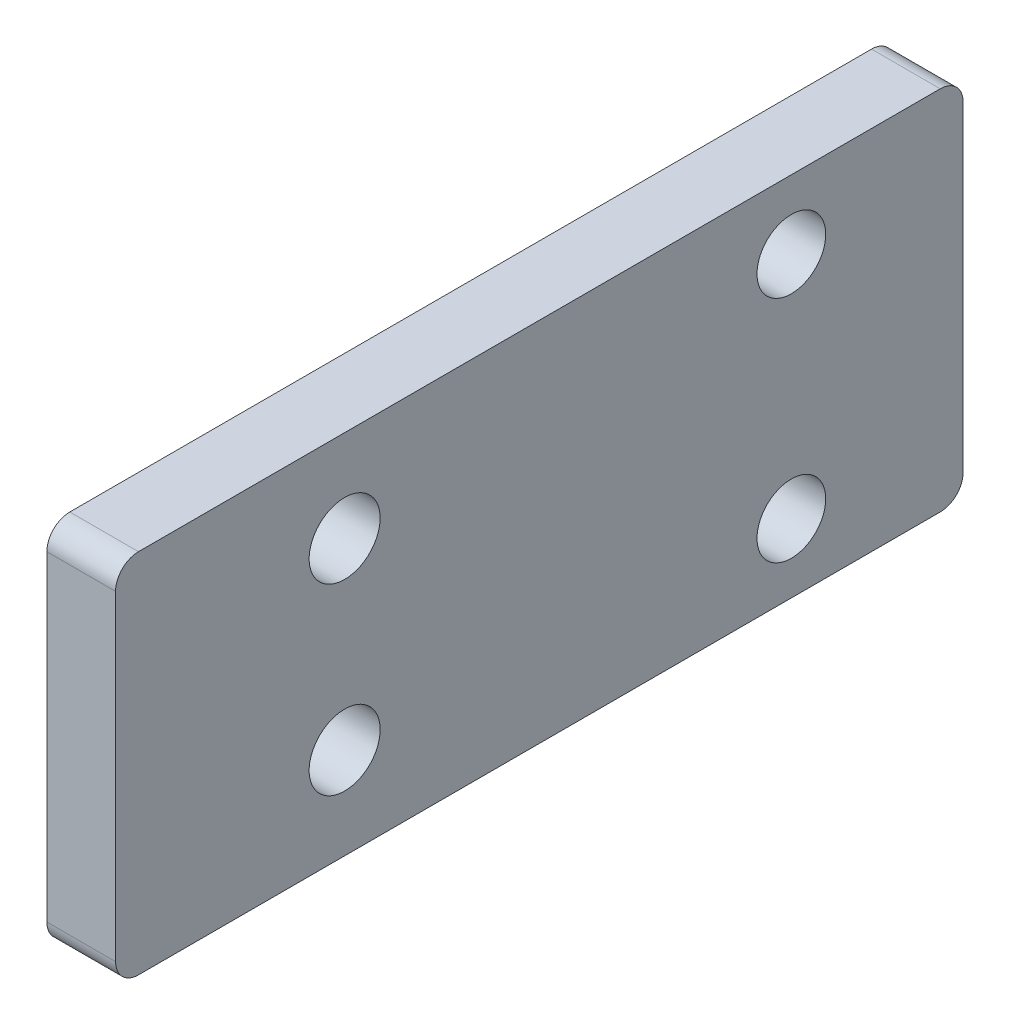
ISO-10303-21;
HEADER;
FILE_DESCRIPTION(('STEP AP214'),'2;1');
FILE_NAME('part.step','',(''),(''),'','','');
FILE_SCHEMA(('AUTOMOTIVE_DESIGN { 1 0 10303 214 1 1 1 1 }'));
ENDSEC;
DATA;
#1=APPLICATION_CONTEXT('core data for automotive mechanical design processes');
#2=APPLICATION_PROTOCOL_DEFINITION('international standard','automotive_design',2000,#1);
#3=PRODUCT_CONTEXT('',#1,'mechanical');
#4=PRODUCT('Part','Part','',(#3));
#5=PRODUCT_RELATED_PRODUCT_CATEGORY('part','',(#4));
#6=PRODUCT_DEFINITION_FORMATION('','',#4);
#7=PRODUCT_DEFINITION_CONTEXT('part definition',#1,'design');
#8=PRODUCT_DEFINITION('design','',#6,#7);
#9=PRODUCT_DEFINITION_SHAPE('','',#8);
#10=(LENGTH_UNIT() NAMED_UNIT(*) SI_UNIT(.MILLI.,.METRE.));
#11=(NAMED_UNIT(*) PLANE_ANGLE_UNIT() SI_UNIT($,.RADIAN.));
#12=(NAMED_UNIT(*) SI_UNIT($,.STERADIAN.) SOLID_ANGLE_UNIT());
#13=UNCERTAINTY_MEASURE_WITH_UNIT(LENGTH_MEASURE(1.E-05),#10,'distance_accuracy_value','');
#14=(GEOMETRIC_REPRESENTATION_CONTEXT(3) GLOBAL_UNCERTAINTY_ASSIGNED_CONTEXT((#13)) GLOBAL_UNIT_ASSIGNED_CONTEXT((#10,
#11,#12)) REPRESENTATION_CONTEXT('',''));
#15=CARTESIAN_POINT('',(0.,0.,0.));
#16=DIRECTION('',(0.,0.,1.));
#17=DIRECTION('',(1.,0.,0.));
#18=AXIS2_PLACEMENT_3D('',#15,#16,#17);
#19=CARTESIAN_POINT('',(3.,0.,18.5));
#20=DIRECTION('',(0.,0.,1.));
#21=DIRECTION('',(1.,0.,0.));
#22=AXIS2_PLACEMENT_3D('',#19,#20,#21);
#23=PLANE('',#22);
#24=DIRECTION('',(0.,1.,0.));
#25=VECTOR('',#24,1.);
#26=CARTESIAN_POINT('',(0.,0.,18.5));
#27=LINE('',#26,#25);
#28=CARTESIAN_POINT('',(0.,-7.,18.5));
#29=VERTEX_POINT('',#28);
#30=CARTESIAN_POINT('',(0.,7.,18.5));
#31=VERTEX_POINT('',#30);
#32=EDGE_CURVE('E161',#29,#31,#27,.T.);
#33=ORIENTED_EDGE('',*,*,#32,.F.);
#34=DIRECTION('',(-1.,0.,0.));
#35=VECTOR('',#34,1.);
#36=CARTESIAN_POINT('',(3.,-7.,18.5));
#37=LINE('',#36,#35);
#38=CARTESIAN_POINT('',(3.,-7.,18.5));
#39=VERTEX_POINT('',#38);
#40=EDGE_CURVE('E11',#29,#39,#37,.F.);
#41=ORIENTED_EDGE('',*,*,#40,.T.);
#42=DIRECTION('',(0.,1.,0.));
#43=VECTOR('',#42,1.);
#44=CARTESIAN_POINT('',(3.,0.,18.5));
#45=LINE('',#44,#43);
#46=CARTESIAN_POINT('',(3.,7.,18.5));
#47=VERTEX_POINT('',#46);
#48=EDGE_CURVE('E163',#39,#47,#45,.T.);
#49=ORIENTED_EDGE('',*,*,#48,.T.);
#50=DIRECTION('',(-1.,0.,0.));
#51=VECTOR('',#50,1.);
#52=CARTESIAN_POINT('',(0.,7.,18.5));
#53=LINE('',#52,#51);
#54=EDGE_CURVE('E44',#47,#31,#53,.T.);
#55=ORIENTED_EDGE('',*,*,#54,.T.);
#56=EDGE_LOOP('',(#33,#41,#49,#55));
#57=FACE_BOUND('',#56,.T.);
#58=ADVANCED_FACE('F36',(#57),#23,.T.);
#59=CARTESIAN_POINT('',(3.,-8.,0.));
#60=DIRECTION('',(0.,-1.,0.));
#61=DIRECTION('',(0.,0.,-1.));
#62=AXIS2_PLACEMENT_3D('',#59,#60,#61);
#63=PLANE('',#62);
#64=DIRECTION('',(0.,0.,1.));
#65=VECTOR('',#64,1.);
#66=CARTESIAN_POINT('',(0.,-8.,0.));
#67=LINE('',#66,#65);
#68=CARTESIAN_POINT('',(0.,-8.,-17.5));
#69=VERTEX_POINT('',#68);
#70=CARTESIAN_POINT('',(0.,-8.,17.5));
#71=VERTEX_POINT('',#70);
#72=EDGE_CURVE('E134',#69,#71,#67,.T.);
#73=ORIENTED_EDGE('',*,*,#72,.F.);
#74=DIRECTION('',(-1.,0.,0.));
#75=VECTOR('',#74,1.);
#76=CARTESIAN_POINT('',(3.,-8.,-17.5));
#77=LINE('',#76,#75);
#78=CARTESIAN_POINT('',(3.,-8.,-17.5));
#79=VERTEX_POINT('',#78);
#80=EDGE_CURVE('E58',#69,#79,#77,.F.);
#81=ORIENTED_EDGE('',*,*,#80,.T.);
#82=DIRECTION('',(0.,0.,1.));
#83=VECTOR('',#82,1.);
#84=CARTESIAN_POINT('',(3.,-8.,0.));
#85=LINE('',#84,#83);
#86=CARTESIAN_POINT('',(3.,-8.,17.5));
#87=VERTEX_POINT('',#86);
#88=EDGE_CURVE('E185',#79,#87,#85,.T.);
#89=ORIENTED_EDGE('',*,*,#88,.T.);
#90=DIRECTION('',(-1.,0.,0.));
#91=VECTOR('',#90,1.);
#92=CARTESIAN_POINT('',(3.,-8.,17.5));
#93=LINE('',#92,#91);
#94=EDGE_CURVE('E153',#87,#71,#93,.T.);
#95=ORIENTED_EDGE('',*,*,#94,.T.);
#96=EDGE_LOOP('',(#73,#81,#89,#95));
#97=FACE_BOUND('',#96,.T.);
#98=ADVANCED_FACE('F215',(#97),#63,.T.);
#99=CARTESIAN_POINT('',(3.,0.,-18.5));
#100=DIRECTION('',(0.,0.,1.));
#101=DIRECTION('',(1.,0.,0.));
#102=AXIS2_PLACEMENT_3D('',#99,#100,#101);
#103=PLANE('',#102);
#104=DIRECTION('',(0.,1.,0.));
#105=VECTOR('',#104,1.);
#106=CARTESIAN_POINT('',(0.,0.,-18.5));
#107=LINE('',#106,#105);
#108=CARTESIAN_POINT('',(0.,-7.,-18.5));
#109=VERTEX_POINT('',#108);
#110=CARTESIAN_POINT('',(0.,7.,-18.5));
#111=VERTEX_POINT('',#110);
#112=EDGE_CURVE('E129',#109,#111,#107,.T.);
#113=ORIENTED_EDGE('',*,*,#112,.T.);
#114=DIRECTION('',(-1.,0.,0.));
#115=VECTOR('',#114,1.);
#116=CARTESIAN_POINT('',(3.,7.,-18.5));
#117=LINE('',#116,#115);
#118=CARTESIAN_POINT('',(3.,7.,-18.5));
#119=VERTEX_POINT('',#118);
#120=EDGE_CURVE('E107',#111,#119,#117,.F.);
#121=ORIENTED_EDGE('',*,*,#120,.T.);
#122=DIRECTION('',(0.,1.,0.));
#123=VECTOR('',#122,1.);
#124=CARTESIAN_POINT('',(3.,0.,-18.5));
#125=LINE('',#124,#123);
#126=CARTESIAN_POINT('',(3.,-7.,-18.5));
#127=VERTEX_POINT('',#126);
#128=EDGE_CURVE('E182',#127,#119,#125,.T.);
#129=ORIENTED_EDGE('',*,*,#128,.F.);
#130=DIRECTION('',(-1.,0.,0.));
#131=VECTOR('',#130,1.);
#132=CARTESIAN_POINT('',(0.,-7.,-18.5));
#133=LINE('',#132,#131);
#134=EDGE_CURVE('E112',#127,#109,#133,.T.);
#135=ORIENTED_EDGE('',*,*,#134,.T.);
#136=EDGE_LOOP('',(#113,#121,#129,#135));
#137=FACE_BOUND('',#136,.T.);
#138=ADVANCED_FACE('F212',(#137),#103,.F.);
#139=CARTESIAN_POINT('',(3.,5.,-11.));
#140=DIRECTION('',(-1.,0.,0.));
#141=DIRECTION('',(0.,0.,1.));
#142=AXIS2_PLACEMENT_3D('',#139,#140,#141);
#143=CYLINDRICAL_SURFACE('',#142,1.5);
#144=CARTESIAN_POINT('',(3.,5.,-11.));
#145=DIRECTION('',(1.,0.,0.));
#146=DIRECTION('',(0.,0.,-1.));
#147=AXIS2_PLACEMENT_3D('',#144,#145,#146);
#148=CIRCLE('',#147,1.5);
#149=CARTESIAN_POINT('',(3.,5.,-12.5));
#150=VERTEX_POINT('',#149);
#151=EDGE_CURVE('E188',#150,#150,#148,.T.);
#152=ORIENTED_EDGE('',*,*,#151,.T.);
#153=EDGE_LOOP('',(#152));
#154=FACE_BOUND('',#153,.T.);
#155=CARTESIAN_POINT('',(0.,5.,-11.));
#156=DIRECTION('',(1.,0.,0.));
#157=DIRECTION('',(0.,0.,-1.));
#158=AXIS2_PLACEMENT_3D('',#155,#156,#157);
#159=CIRCLE('',#158,1.5);
#160=CARTESIAN_POINT('',(0.,5.,-12.5));
#161=VERTEX_POINT('',#160);
#162=EDGE_CURVE('E167',#161,#161,#159,.T.);
#163=ORIENTED_EDGE('',*,*,#162,.F.);
#164=EDGE_LOOP('',(#163));
#165=FACE_BOUND('',#164,.T.);
#166=ADVANCED_FACE('F231',(#154,#165),#143,.F.);
#167=CARTESIAN_POINT('',(3.,-5.,-11.));
#168=DIRECTION('',(-1.,0.,0.));
#169=DIRECTION('',(0.,0.,1.));
#170=AXIS2_PLACEMENT_3D('',#167,#168,#169);
#171=CYLINDRICAL_SURFACE('',#170,1.5);
#172=CARTESIAN_POINT('',(3.,-5.,-11.));
#173=DIRECTION('',(1.,0.,0.));
#174=DIRECTION('',(0.,0.,-1.));
#175=AXIS2_PLACEMENT_3D('',#172,#173,#174);
#176=CIRCLE('',#175,1.5);
#177=CARTESIAN_POINT('',(3.,-5.,-12.5));
#178=VERTEX_POINT('',#177);
#179=EDGE_CURVE('E191',#178,#178,#176,.T.);
#180=ORIENTED_EDGE('',*,*,#179,.T.);
#181=EDGE_LOOP('',(#180));
#182=FACE_BOUND('',#181,.T.);
#183=CARTESIAN_POINT('',(0.,-5.,-11.));
#184=DIRECTION('',(1.,0.,0.));
#185=DIRECTION('',(0.,0.,-1.));
#186=AXIS2_PLACEMENT_3D('',#183,#184,#185);
#187=CIRCLE('',#186,1.5);
#188=CARTESIAN_POINT('',(0.,-5.,-12.5));
#189=VERTEX_POINT('',#188);
#190=EDGE_CURVE('E170',#189,#189,#187,.T.);
#191=ORIENTED_EDGE('',*,*,#190,.F.);
#192=EDGE_LOOP('',(#191));
#193=FACE_BOUND('',#192,.T.);
#194=ADVANCED_FACE('F234',(#182,#193),#171,.F.);
#195=CARTESIAN_POINT('',(3.,4.,8.5));
#196=DIRECTION('',(-1.,0.,0.));
#197=DIRECTION('',(0.,0.,1.));
#198=AXIS2_PLACEMENT_3D('',#195,#196,#197);
#199=CYLINDRICAL_SURFACE('',#198,1.55);
#200=CARTESIAN_POINT('',(3.,4.,8.5));
#201=DIRECTION('',(1.,0.,0.));
#202=DIRECTION('',(0.,0.,-1.));
#203=AXIS2_PLACEMENT_3D('',#200,#201,#202);
#204=CIRCLE('',#203,1.55);
#205=CARTESIAN_POINT('',(3.,4.,6.95));
#206=VERTEX_POINT('',#205);
#207=EDGE_CURVE('E132',#206,#206,#204,.T.);
#208=ORIENTED_EDGE('',*,*,#207,.T.);
#209=EDGE_LOOP('',(#208));
#210=FACE_BOUND('',#209,.T.);
#211=CARTESIAN_POINT('',(0.,4.,8.5));
#212=DIRECTION('',(1.,0.,0.));
#213=DIRECTION('',(0.,0.,-1.));
#214=AXIS2_PLACEMENT_3D('',#211,#212,#213);
#215=CIRCLE('',#214,1.55);
#216=CARTESIAN_POINT('',(0.,4.,6.95));
#217=VERTEX_POINT('',#216);
#218=EDGE_CURVE('E175',#217,#217,#215,.T.);
#219=ORIENTED_EDGE('',*,*,#218,.F.);
#220=EDGE_LOOP('',(#219));
#221=FACE_BOUND('',#220,.T.);
#222=ADVANCED_FACE('F197',(#210,#221),#199,.F.);
#223=CARTESIAN_POINT('',(3.,-4.,8.5));
#224=DIRECTION('',(-1.,0.,0.));
#225=DIRECTION('',(0.,0.,1.));
#226=AXIS2_PLACEMENT_3D('',#223,#224,#225);
#227=CYLINDRICAL_SURFACE('',#226,1.55);
#228=CARTESIAN_POINT('',(3.,-4.,8.5));
#229=DIRECTION('',(1.,0.,0.));
#230=DIRECTION('',(0.,0.,-1.));
#231=AXIS2_PLACEMENT_3D('',#228,#229,#230);
#232=CIRCLE('',#231,1.55);
#233=CARTESIAN_POINT('',(3.,-4.,6.95));
#234=VERTEX_POINT('',#233);
#235=EDGE_CURVE('E128',#234,#234,#232,.T.);
#236=ORIENTED_EDGE('',*,*,#235,.T.);
#237=EDGE_LOOP('',(#236));
#238=FACE_BOUND('',#237,.T.);
#239=CARTESIAN_POINT('',(0.,-4.,8.5));
#240=DIRECTION('',(1.,0.,0.));
#241=DIRECTION('',(0.,0.,-1.));
#242=AXIS2_PLACEMENT_3D('',#239,#240,#241);
#243=CIRCLE('',#242,1.55);
#244=CARTESIAN_POINT('',(0.,-4.,6.95));
#245=VERTEX_POINT('',#244);
#246=EDGE_CURVE('E178',#245,#245,#243,.T.);
#247=ORIENTED_EDGE('',*,*,#246,.F.);
#248=EDGE_LOOP('',(#247));
#249=FACE_BOUND('',#248,.T.);
#250=ADVANCED_FACE('F241',(#238,#249),#227,.F.);
#251=CARTESIAN_POINT('',(3.,8.,0.));
#252=DIRECTION('',(0.,-1.,0.));
#253=DIRECTION('',(0.,0.,-1.));
#254=AXIS2_PLACEMENT_3D('',#251,#252,#253);
#255=PLANE('',#254);
#256=DIRECTION('',(0.,0.,1.));
#257=VECTOR('',#256,1.);
#258=CARTESIAN_POINT('',(3.,8.,0.));
#259=LINE('',#258,#257);
#260=CARTESIAN_POINT('',(3.,8.,-17.5));
#261=VERTEX_POINT('',#260);
#262=CARTESIAN_POINT('',(3.,8.,17.5));
#263=VERTEX_POINT('',#262);
#264=EDGE_CURVE('E122',#261,#263,#259,.T.);
#265=ORIENTED_EDGE('',*,*,#264,.F.);
#266=DIRECTION('',(-1.,0.,0.));
#267=VECTOR('',#266,1.);
#268=CARTESIAN_POINT('',(3.,8.,-17.5));
#269=LINE('',#268,#267);
#270=CARTESIAN_POINT('',(0.,8.,-17.5));
#271=VERTEX_POINT('',#270);
#272=EDGE_CURVE('E106',#261,#271,#269,.T.);
#273=ORIENTED_EDGE('',*,*,#272,.T.);
#274=DIRECTION('',(0.,0.,1.));
#275=VECTOR('',#274,1.);
#276=CARTESIAN_POINT('',(0.,8.,0.));
#277=LINE('',#276,#275);
#278=CARTESIAN_POINT('',(0.,8.,17.5));
#279=VERTEX_POINT('',#278);
#280=EDGE_CURVE('E119',#271,#279,#277,.T.);
#281=ORIENTED_EDGE('',*,*,#280,.T.);
#282=DIRECTION('',(-1.,0.,0.));
#283=VECTOR('',#282,1.);
#284=CARTESIAN_POINT('',(3.,8.,17.5));
#285=LINE('',#284,#283);
#286=EDGE_CURVE('E124',#279,#263,#285,.F.);
#287=ORIENTED_EDGE('',*,*,#286,.T.);
#288=EDGE_LOOP('',(#265,#273,#281,#287));
#289=FACE_BOUND('',#288,.T.);
#290=ADVANCED_FACE('F118',(#289),#255,.F.);
#291=CARTESIAN_POINT('',(3.,0.,0.));
#292=DIRECTION('',(1.,0.,0.));
#293=DIRECTION('',(0.,0.,-1.));
#294=AXIS2_PLACEMENT_3D('',#291,#292,#293);
#295=PLANE('',#294);
#296=ORIENTED_EDGE('',*,*,#235,.F.);
#297=EDGE_LOOP('',(#296));
#298=FACE_BOUND('',#297,.T.);
#299=ORIENTED_EDGE('',*,*,#207,.F.);
#300=EDGE_LOOP('',(#299));
#301=FACE_BOUND('',#300,.T.);
#302=ORIENTED_EDGE('',*,*,#179,.F.);
#303=EDGE_LOOP('',(#302));
#304=FACE_BOUND('',#303,.T.);
#305=ORIENTED_EDGE('',*,*,#151,.F.);
#306=EDGE_LOOP('',(#305));
#307=FACE_BOUND('',#306,.T.);
#308=ORIENTED_EDGE('',*,*,#128,.T.);
#309=CARTESIAN_POINT('',(3.,7.,-17.5));
#310=DIRECTION('',(1.,0.,0.));
#311=DIRECTION('',(0.,0.,-1.));
#312=AXIS2_PLACEMENT_3D('',#309,#310,#311);
#313=CIRCLE('',#312,1.);
#314=EDGE_CURVE('E151',#119,#261,#313,.T.);
#315=ORIENTED_EDGE('',*,*,#314,.T.);
#316=ORIENTED_EDGE('',*,*,#264,.T.);
#317=CARTESIAN_POINT('',(3.,7.,17.5));
#318=DIRECTION('',(1.,0.,0.));
#319=DIRECTION('',(0.,0.,-1.));
#320=AXIS2_PLACEMENT_3D('',#317,#318,#319);
#321=CIRCLE('',#320,1.);
#322=EDGE_CURVE('E146',#263,#47,#321,.T.);
#323=ORIENTED_EDGE('',*,*,#322,.T.);
#324=ORIENTED_EDGE('',*,*,#48,.F.);
#325=CARTESIAN_POINT('',(3.,-7.,17.5));
#326=DIRECTION('',(1.,0.,0.));
#327=DIRECTION('',(0.,0.,-1.));
#328=AXIS2_PLACEMENT_3D('',#325,#326,#327);
#329=CIRCLE('',#328,1.);
#330=EDGE_CURVE('E51',#39,#87,#329,.T.);
#331=ORIENTED_EDGE('',*,*,#330,.T.);
#332=ORIENTED_EDGE('',*,*,#88,.F.);
#333=CARTESIAN_POINT('',(3.,-7.,-17.5));
#334=DIRECTION('',(1.,0.,0.));
#335=DIRECTION('',(0.,0.,-1.));
#336=AXIS2_PLACEMENT_3D('',#333,#334,#335);
#337=CIRCLE('',#336,1.);
#338=EDGE_CURVE('E149',#79,#127,#337,.T.);
#339=ORIENTED_EDGE('',*,*,#338,.T.);
#340=EDGE_LOOP('',(#308,#315,#316,#323,#324,#331,#332,#339));
#341=FACE_BOUND('',#340,.T.);
#342=ADVANCED_FACE('F200',(#298,#301,#304,#307,#341),#295,.T.);
#343=CARTESIAN_POINT('',(0.,0.,0.));
#344=DIRECTION('',(1.,0.,0.));
#345=DIRECTION('',(0.,0.,-1.));
#346=AXIS2_PLACEMENT_3D('',#343,#344,#345);
#347=PLANE('',#346);
#348=ORIENTED_EDGE('',*,*,#246,.T.);
#349=EDGE_LOOP('',(#348));
#350=FACE_BOUND('',#349,.T.);
#351=ORIENTED_EDGE('',*,*,#218,.T.);
#352=EDGE_LOOP('',(#351));
#353=FACE_BOUND('',#352,.T.);
#354=ORIENTED_EDGE('',*,*,#190,.T.);
#355=EDGE_LOOP('',(#354));
#356=FACE_BOUND('',#355,.T.);
#357=ORIENTED_EDGE('',*,*,#162,.T.);
#358=EDGE_LOOP('',(#357));
#359=FACE_BOUND('',#358,.T.);
#360=ORIENTED_EDGE('',*,*,#280,.F.);
#361=CARTESIAN_POINT('',(0.,7.,-17.5));
#362=DIRECTION('',(1.,0.,0.));
#363=DIRECTION('',(0.,0.,-1.));
#364=AXIS2_PLACEMENT_3D('',#361,#362,#363);
#365=CIRCLE('',#364,1.);
#366=EDGE_CURVE('E102',#271,#111,#365,.F.);
#367=ORIENTED_EDGE('',*,*,#366,.T.);
#368=ORIENTED_EDGE('',*,*,#112,.F.);
#369=CARTESIAN_POINT('',(0.,-7.,-17.5));
#370=DIRECTION('',(1.,0.,0.));
#371=DIRECTION('',(0.,0.,-1.));
#372=AXIS2_PLACEMENT_3D('',#369,#370,#371);
#373=CIRCLE('',#372,1.);
#374=EDGE_CURVE('E113',#109,#69,#373,.F.);
#375=ORIENTED_EDGE('',*,*,#374,.T.);
#376=ORIENTED_EDGE('',*,*,#72,.T.);
#377=CARTESIAN_POINT('',(0.,-7.,17.5));
#378=DIRECTION('',(1.,0.,0.));
#379=DIRECTION('',(0.,0.,-1.));
#380=AXIS2_PLACEMENT_3D('',#377,#378,#379);
#381=CIRCLE('',#380,1.);
#382=EDGE_CURVE('E140',#71,#29,#381,.F.);
#383=ORIENTED_EDGE('',*,*,#382,.T.);
#384=ORIENTED_EDGE('',*,*,#32,.T.);
#385=CARTESIAN_POINT('',(0.,7.,17.5));
#386=DIRECTION('',(1.,0.,0.));
#387=DIRECTION('',(0.,0.,-1.));
#388=AXIS2_PLACEMENT_3D('',#385,#386,#387);
#389=CIRCLE('',#388,1.);
#390=EDGE_CURVE('E123',#31,#279,#389,.F.);
#391=ORIENTED_EDGE('',*,*,#390,.T.);
#392=EDGE_LOOP('',(#360,#367,#368,#375,#376,#383,#384,#391));
#393=FACE_BOUND('',#392,.T.);
#394=ADVANCED_FACE('F126',(#350,#353,#356,#359,#393),#347,.F.);
#395=CARTESIAN_POINT('',(3.,7.,-17.5));
#396=DIRECTION('',(-1.,0.,0.));
#397=DIRECTION('',(0.,0.,1.));
#398=AXIS2_PLACEMENT_3D('',#395,#396,#397);
#399=CYLINDRICAL_SURFACE('',#398,1.);
#400=ORIENTED_EDGE('',*,*,#314,.F.);
#401=ORIENTED_EDGE('',*,*,#120,.F.);
#402=ORIENTED_EDGE('',*,*,#366,.F.);
#403=ORIENTED_EDGE('',*,*,#272,.F.);
#404=EDGE_LOOP('',(#400,#401,#402,#403));
#405=FACE_BOUND('',#404,.T.);
#406=ADVANCED_FACE('F105',(#405),#399,.T.);
#407=CARTESIAN_POINT('',(3.,-7.,-17.5));
#408=DIRECTION('',(1.,0.,0.));
#409=DIRECTION('',(0.,0.,-1.));
#410=AXIS2_PLACEMENT_3D('',#407,#408,#409);
#411=CYLINDRICAL_SURFACE('',#410,1.);
#412=ORIENTED_EDGE('',*,*,#338,.F.);
#413=ORIENTED_EDGE('',*,*,#80,.F.);
#414=ORIENTED_EDGE('',*,*,#374,.F.);
#415=ORIENTED_EDGE('',*,*,#134,.F.);
#416=EDGE_LOOP('',(#412,#413,#414,#415));
#417=FACE_BOUND('',#416,.T.);
#418=ADVANCED_FACE('F214',(#417),#411,.T.);
#419=CARTESIAN_POINT('',(3.,-7.,17.5));
#420=DIRECTION('',(-1.,0.,0.));
#421=DIRECTION('',(0.,0.,1.));
#422=AXIS2_PLACEMENT_3D('',#419,#420,#421);
#423=CYLINDRICAL_SURFACE('',#422,1.);
#424=ORIENTED_EDGE('',*,*,#330,.F.);
#425=ORIENTED_EDGE('',*,*,#40,.F.);
#426=ORIENTED_EDGE('',*,*,#382,.F.);
#427=ORIENTED_EDGE('',*,*,#94,.F.);
#428=EDGE_LOOP('',(#424,#425,#426,#427));
#429=FACE_BOUND('',#428,.T.);
#430=ADVANCED_FACE('F218',(#429),#423,.T.);
#431=CARTESIAN_POINT('',(3.,7.,17.5));
#432=DIRECTION('',(1.,0.,0.));
#433=DIRECTION('',(0.,0.,-1.));
#434=AXIS2_PLACEMENT_3D('',#431,#432,#433);
#435=CYLINDRICAL_SURFACE('',#434,1.);
#436=ORIENTED_EDGE('',*,*,#322,.F.);
#437=ORIENTED_EDGE('',*,*,#286,.F.);
#438=ORIENTED_EDGE('',*,*,#390,.F.);
#439=ORIENTED_EDGE('',*,*,#54,.F.);
#440=EDGE_LOOP('',(#436,#437,#438,#439));
#441=FACE_BOUND('',#440,.T.);
#442=ADVANCED_FACE('F38',(#441),#435,.T.);
#443=CLOSED_SHELL('',(#58,#98,#138,#166,#194,#222,#250,#290,#342,#394,#406,#418,#430,#442));
#444=MANIFOLD_SOLID_BREP('B2',#443);
#445=ADVANCED_BREP_SHAPE_REPRESENTATION('',(#18,#444),#14);
#446=SHAPE_DEFINITION_REPRESENTATION(#9,#445);
ENDSEC;
END-ISO-10303-21;
